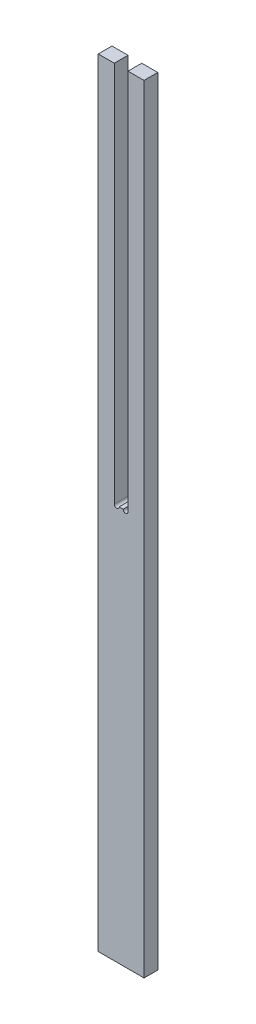
ISO-10303-21;
HEADER;
FILE_DESCRIPTION(('STEP AP214'),'2;1');
FILE_NAME('part.step','',(''),(''),'','','');
FILE_SCHEMA(('AUTOMOTIVE_DESIGN { 1 0 10303 214 1 1 1 1 }'));
ENDSEC;
DATA;
#1=APPLICATION_CONTEXT('core data for automotive mechanical design processes');
#2=APPLICATION_PROTOCOL_DEFINITION('international standard','automotive_design',2000,#1);
#3=PRODUCT_CONTEXT('',#1,'mechanical');
#4=PRODUCT('Part','Part','',(#3));
#5=PRODUCT_RELATED_PRODUCT_CATEGORY('part','',(#4));
#6=PRODUCT_DEFINITION_FORMATION('','',#4);
#7=PRODUCT_DEFINITION_CONTEXT('part definition',#1,'design');
#8=PRODUCT_DEFINITION('design','',#6,#7);
#9=PRODUCT_DEFINITION_SHAPE('','',#8);
#10=(LENGTH_UNIT() NAMED_UNIT(*) SI_UNIT(.MILLI.,.METRE.));
#11=(NAMED_UNIT(*) PLANE_ANGLE_UNIT() SI_UNIT($,.RADIAN.));
#12=(NAMED_UNIT(*) SI_UNIT($,.STERADIAN.) SOLID_ANGLE_UNIT());
#13=UNCERTAINTY_MEASURE_WITH_UNIT(LENGTH_MEASURE(1.E-05),#10,'distance_accuracy_value','');
#14=(GEOMETRIC_REPRESENTATION_CONTEXT(3) GLOBAL_UNCERTAINTY_ASSIGNED_CONTEXT((#13)) GLOBAL_UNIT_ASSIGNED_CONTEXT((#10,
#11,#12)) REPRESENTATION_CONTEXT('',''));
#15=CARTESIAN_POINT('',(0.,0.,0.));
#16=DIRECTION('',(0.,0.,1.));
#17=DIRECTION('',(1.,0.,0.));
#18=AXIS2_PLACEMENT_3D('',#15,#16,#17);
#19=CARTESIAN_POINT('',(-33.2222222222223,843.,18.));
#20=DIRECTION('',(0.,1.,0.));
#21=DIRECTION('',(0.,0.,1.));
#22=AXIS2_PLACEMENT_3D('',#19,#20,#21);
#23=PLANE('',#22);
#24=DIRECTION('',(1.,0.,0.));
#25=VECTOR('',#24,1.);
#26=CARTESIAN_POINT('',(-33.2222222222223,843.,0.));
#27=LINE('',#26,#25);
#28=CARTESIAN_POINT('',(-33.2222222222223,843.,0.));
#29=VERTEX_POINT('',#28);
#30=CARTESIAN_POINT('',(-12.2222222222223,843.,0.));
#31=VERTEX_POINT('',#30);
#32=EDGE_CURVE('E142',#29,#31,#27,.T.);
#33=ORIENTED_EDGE('',*,*,#32,.F.);
#34=DIRECTION('',(0.,0.,-1.));
#35=VECTOR('',#34,1.);
#36=CARTESIAN_POINT('',(-33.2222222222223,843.,18.));
#37=LINE('',#36,#35);
#38=CARTESIAN_POINT('',(-33.2222222222223,843.,18.));
#39=VERTEX_POINT('',#38);
#40=EDGE_CURVE('E11',#39,#29,#37,.T.);
#41=ORIENTED_EDGE('',*,*,#40,.F.);
#42=DIRECTION('',(1.,0.,0.));
#43=VECTOR('',#42,1.);
#44=CARTESIAN_POINT('',(-33.2222222222223,843.,18.));
#45=LINE('',#44,#43);
#46=CARTESIAN_POINT('',(-12.2222222222223,843.,18.));
#47=VERTEX_POINT('',#46);
#48=EDGE_CURVE('E167',#39,#47,#45,.T.);
#49=ORIENTED_EDGE('',*,*,#48,.T.);
#50=DIRECTION('',(0.,0.,-1.));
#51=VECTOR('',#50,1.);
#52=CARTESIAN_POINT('',(-12.2222222222223,843.,18.));
#53=LINE('',#52,#51);
#54=EDGE_CURVE('E36',#47,#31,#53,.T.);
#55=ORIENTED_EDGE('',*,*,#54,.T.);
#56=EDGE_LOOP('',(#33,#41,#49,#55));
#57=FACE_BOUND('',#56,.T.);
#58=ADVANCED_FACE('F33',(#57),#23,.T.);
#59=CARTESIAN_POINT('',(-33.2222222222223,343.,18.));
#60=DIRECTION('',(-1.,0.,0.));
#61=DIRECTION('',(0.,0.,1.));
#62=AXIS2_PLACEMENT_3D('',#59,#60,#61);
#63=PLANE('',#62);
#64=DIRECTION('',(0.,1.,0.));
#65=VECTOR('',#64,1.);
#66=CARTESIAN_POINT('',(-33.2222222222223,343.,0.));
#67=LINE('',#66,#65);
#68=CARTESIAN_POINT('',(-33.2222222222223,343.,0.));
#69=VERTEX_POINT('',#68);
#70=EDGE_CURVE('E165',#69,#29,#67,.T.);
#71=ORIENTED_EDGE('',*,*,#70,.F.);
#72=DIRECTION('',(0.,0.,-1.));
#73=VECTOR('',#72,1.);
#74=CARTESIAN_POINT('',(-33.2222222222223,343.,18.));
#75=LINE('',#74,#73);
#76=CARTESIAN_POINT('',(-33.2222222222223,343.,18.));
#77=VERTEX_POINT('',#76);
#78=EDGE_CURVE('E42',#77,#69,#75,.T.);
#79=ORIENTED_EDGE('',*,*,#78,.F.);
#80=DIRECTION('',(0.,1.,0.));
#81=VECTOR('',#80,1.);
#82=CARTESIAN_POINT('',(-33.2222222222223,343.,18.));
#83=LINE('',#82,#81);
#84=EDGE_CURVE('E124',#77,#39,#83,.T.);
#85=ORIENTED_EDGE('',*,*,#84,.T.);
#86=ORIENTED_EDGE('',*,*,#40,.T.);
#87=EDGE_LOOP('',(#71,#79,#85,#86));
#88=FACE_BOUND('',#87,.T.);
#89=ADVANCED_FACE('F185',(#88),#63,.T.);
#90=CARTESIAN_POINT('',(-36.3972222222223,343.,18.));
#91=DIRECTION('',(0.,0.,-1.));
#92=DIRECTION('',(-1.,0.,0.));
#93=AXIS2_PLACEMENT_3D('',#90,#91,#92);
#94=CYLINDRICAL_SURFACE('',#93,3.175);
#95=CARTESIAN_POINT('',(-36.3972222222223,343.,0.));
#96=DIRECTION('',(0.,0.,-1.));
#97=DIRECTION('',(-1.,0.,0.));
#98=AXIS2_PLACEMENT_3D('',#95,#96,#97);
#99=CIRCLE('',#98,3.175);
#100=CARTESIAN_POINT('',(-39.5722222222223,343.,0.));
#101=VERTEX_POINT('',#100);
#102=EDGE_CURVE('E128',#69,#101,#99,.T.);
#103=ORIENTED_EDGE('',*,*,#102,.T.);
#104=DIRECTION('',(0.,0.,-1.));
#105=VECTOR('',#104,1.);
#106=CARTESIAN_POINT('',(-39.5722222222223,343.,18.));
#107=LINE('',#106,#105);
#108=CARTESIAN_POINT('',(-39.5722222222223,343.,18.));
#109=VERTEX_POINT('',#108);
#110=EDGE_CURVE('E126',#109,#101,#107,.T.);
#111=ORIENTED_EDGE('',*,*,#110,.F.);
#112=CARTESIAN_POINT('',(-36.3972222222223,343.,18.));
#113=DIRECTION('',(0.,0.,-1.));
#114=DIRECTION('',(-1.,0.,0.));
#115=AXIS2_PLACEMENT_3D('',#112,#113,#114);
#116=CIRCLE('',#115,3.175);
#117=EDGE_CURVE('E117',#77,#109,#116,.T.);
#118=ORIENTED_EDGE('',*,*,#117,.F.);
#119=ORIENTED_EDGE('',*,*,#78,.T.);
#120=EDGE_LOOP('',(#103,#111,#118,#119));
#121=FACE_BOUND('',#120,.T.);
#122=ADVANCED_FACE('F127',(#121),#94,.F.);
#123=CARTESIAN_POINT('',(-44.8722222222223,343.,18.));
#124=DIRECTION('',(0.,1.,0.));
#125=DIRECTION('',(0.,0.,1.));
#126=AXIS2_PLACEMENT_3D('',#123,#124,#125);
#127=PLANE('',#126);
#128=DIRECTION('',(1.,0.,0.));
#129=VECTOR('',#128,1.);
#130=CARTESIAN_POINT('',(-44.8722222222223,343.,0.));
#131=LINE('',#130,#129);
#132=CARTESIAN_POINT('',(-44.8722222222223,343.,0.));
#133=VERTEX_POINT('',#132);
#134=EDGE_CURVE('E162',#133,#101,#131,.T.);
#135=ORIENTED_EDGE('',*,*,#134,.F.);
#136=DIRECTION('',(0.,0.,-1.));
#137=VECTOR('',#136,1.);
#138=CARTESIAN_POINT('',(-44.8722222222223,343.,18.));
#139=LINE('',#138,#137);
#140=CARTESIAN_POINT('',(-44.8722222222223,343.,18.));
#141=VERTEX_POINT('',#140);
#142=EDGE_CURVE('E132',#141,#133,#139,.T.);
#143=ORIENTED_EDGE('',*,*,#142,.F.);
#144=DIRECTION('',(1.,0.,0.));
#145=VECTOR('',#144,1.);
#146=CARTESIAN_POINT('',(-44.8722222222223,343.,18.));
#147=LINE('',#146,#145);
#148=EDGE_CURVE('E122',#141,#109,#147,.T.);
#149=ORIENTED_EDGE('',*,*,#148,.T.);
#150=ORIENTED_EDGE('',*,*,#110,.T.);
#151=EDGE_LOOP('',(#135,#143,#149,#150));
#152=FACE_BOUND('',#151,.T.);
#153=ADVANCED_FACE('F134',(#152),#127,.T.);
#154=CARTESIAN_POINT('',(-48.0472222222223,343.,18.));
#155=DIRECTION('',(0.,0.,-1.));
#156=DIRECTION('',(-1.,0.,0.));
#157=AXIS2_PLACEMENT_3D('',#154,#155,#156);
#158=CYLINDRICAL_SURFACE('',#157,3.175);
#159=CARTESIAN_POINT('',(-48.0472222222223,343.,0.));
#160=DIRECTION('',(0.,0.,1.));
#161=DIRECTION('',(1.,0.,0.));
#162=AXIS2_PLACEMENT_3D('',#159,#160,#161);
#163=CIRCLE('',#162,3.175);
#164=CARTESIAN_POINT('',(-51.2222222222223,343.,0.));
#165=VERTEX_POINT('',#164);
#166=EDGE_CURVE('E159',#165,#133,#163,.T.);
#167=ORIENTED_EDGE('',*,*,#166,.F.);
#168=DIRECTION('',(0.,0.,-1.));
#169=VECTOR('',#168,1.);
#170=CARTESIAN_POINT('',(-51.2222222222223,343.,18.));
#171=LINE('',#170,#169);
#172=CARTESIAN_POINT('',(-51.2222222222223,343.,18.));
#173=VERTEX_POINT('',#172);
#174=EDGE_CURVE('E171',#173,#165,#171,.T.);
#175=ORIENTED_EDGE('',*,*,#174,.F.);
#176=CARTESIAN_POINT('',(-48.0472222222223,343.,18.));
#177=DIRECTION('',(0.,0.,1.));
#178=DIRECTION('',(1.,0.,0.));
#179=AXIS2_PLACEMENT_3D('',#176,#177,#178);
#180=CIRCLE('',#179,3.175);
#181=EDGE_CURVE('E135',#173,#141,#180,.T.);
#182=ORIENTED_EDGE('',*,*,#181,.T.);
#183=ORIENTED_EDGE('',*,*,#142,.T.);
#184=EDGE_LOOP('',(#167,#175,#182,#183));
#185=FACE_BOUND('',#184,.T.);
#186=ADVANCED_FACE('F198',(#185),#158,.F.);
#187=CARTESIAN_POINT('',(-51.2222222222223,843.,18.));
#188=DIRECTION('',(1.,0.,0.));
#189=DIRECTION('',(0.,1.,0.));
#190=AXIS2_PLACEMENT_3D('',#187,#188,#189);
#191=PLANE('',#190);
#192=DIRECTION('',(0.,-1.,0.));
#193=VECTOR('',#192,1.);
#194=CARTESIAN_POINT('',(-51.2222222222223,843.,0.));
#195=LINE('',#194,#193);
#196=CARTESIAN_POINT('',(-51.2222222222223,843.,0.));
#197=VERTEX_POINT('',#196);
#198=EDGE_CURVE('E156',#197,#165,#195,.T.);
#199=ORIENTED_EDGE('',*,*,#198,.F.);
#200=DIRECTION('',(0.,0.,-1.));
#201=VECTOR('',#200,1.);
#202=CARTESIAN_POINT('',(-51.2222222222223,843.,18.));
#203=LINE('',#202,#201);
#204=CARTESIAN_POINT('',(-51.2222222222223,843.,18.));
#205=VERTEX_POINT('',#204);
#206=EDGE_CURVE('E173',#205,#197,#203,.T.);
#207=ORIENTED_EDGE('',*,*,#206,.F.);
#208=DIRECTION('',(0.,-1.,0.));
#209=VECTOR('',#208,1.);
#210=CARTESIAN_POINT('',(-51.2222222222223,843.,18.));
#211=LINE('',#210,#209);
#212=EDGE_CURVE('E137',#205,#173,#211,.T.);
#213=ORIENTED_EDGE('',*,*,#212,.T.);
#214=ORIENTED_EDGE('',*,*,#174,.T.);
#215=EDGE_LOOP('',(#199,#207,#213,#214));
#216=FACE_BOUND('',#215,.T.);
#217=ADVANCED_FACE('F201',(#216),#191,.T.);
#218=CARTESIAN_POINT('',(-72.2222222222223,843.,18.));
#219=DIRECTION('',(0.,1.,0.));
#220=DIRECTION('',(0.,0.,1.));
#221=AXIS2_PLACEMENT_3D('',#218,#219,#220);
#222=PLANE('',#221);
#223=DIRECTION('',(1.,0.,0.));
#224=VECTOR('',#223,1.);
#225=CARTESIAN_POINT('',(-72.2222222222223,843.,0.));
#226=LINE('',#225,#224);
#227=CARTESIAN_POINT('',(-72.2222222222223,843.,0.));
#228=VERTEX_POINT('',#227);
#229=EDGE_CURVE('E153',#228,#197,#226,.T.);
#230=ORIENTED_EDGE('',*,*,#229,.F.);
#231=DIRECTION('',(0.,0.,-1.));
#232=VECTOR('',#231,1.);
#233=CARTESIAN_POINT('',(-72.2222222222223,843.,18.));
#234=LINE('',#233,#232);
#235=CARTESIAN_POINT('',(-72.2222222222223,843.,18.));
#236=VERTEX_POINT('',#235);
#237=EDGE_CURVE('E175',#236,#228,#234,.T.);
#238=ORIENTED_EDGE('',*,*,#237,.F.);
#239=DIRECTION('',(1.,0.,0.));
#240=VECTOR('',#239,1.);
#241=CARTESIAN_POINT('',(-72.2222222222223,843.,18.));
#242=LINE('',#241,#240);
#243=EDGE_CURVE('E298',#236,#205,#242,.T.);
#244=ORIENTED_EDGE('',*,*,#243,.T.);
#245=ORIENTED_EDGE('',*,*,#206,.T.);
#246=EDGE_LOOP('',(#230,#238,#244,#245));
#247=FACE_BOUND('',#246,.T.);
#248=ADVANCED_FACE('F205',(#247),#222,.T.);
#249=CARTESIAN_POINT('',(-72.2222222222223,843.,18.));
#250=DIRECTION('',(1.,0.,0.));
#251=DIRECTION('',(0.,1.,0.));
#252=AXIS2_PLACEMENT_3D('',#249,#250,#251);
#253=PLANE('',#252);
#254=DIRECTION('',(0.,-1.,0.));
#255=VECTOR('',#254,1.);
#256=CARTESIAN_POINT('',(-72.2222222222223,843.,0.));
#257=LINE('',#256,#255);
#258=CARTESIAN_POINT('',(-72.2222222222222,-175.,0.));
#259=VERTEX_POINT('',#258);
#260=EDGE_CURVE('E151',#228,#259,#257,.T.);
#261=ORIENTED_EDGE('',*,*,#260,.T.);
#262=DIRECTION('',(0.,0.,-1.));
#263=VECTOR('',#262,1.);
#264=CARTESIAN_POINT('',(-72.2222222222222,-175.,18.));
#265=LINE('',#264,#263);
#266=CARTESIAN_POINT('',(-72.2222222222222,-175.,18.));
#267=VERTEX_POINT('',#266);
#268=EDGE_CURVE('E177',#267,#259,#265,.T.);
#269=ORIENTED_EDGE('',*,*,#268,.F.);
#270=DIRECTION('',(0.,-1.,0.));
#271=VECTOR('',#270,1.);
#272=CARTESIAN_POINT('',(-72.2222222222223,843.,18.));
#273=LINE('',#272,#271);
#274=EDGE_CURVE('E302',#236,#267,#273,.T.);
#275=ORIENTED_EDGE('',*,*,#274,.F.);
#276=ORIENTED_EDGE('',*,*,#237,.T.);
#277=EDGE_LOOP('',(#261,#269,#275,#276));
#278=FACE_BOUND('',#277,.T.);
#279=ADVANCED_FACE('F209',(#278),#253,.F.);
#280=CARTESIAN_POINT('',(-72.2222222222222,-175.,18.));
#281=DIRECTION('',(0.,1.,0.));
#282=DIRECTION('',(0.,0.,1.));
#283=AXIS2_PLACEMENT_3D('',#280,#281,#282);
#284=PLANE('',#283);
#285=DIRECTION('',(1.,0.,0.));
#286=VECTOR('',#285,1.);
#287=CARTESIAN_POINT('',(-72.2222222222222,-175.,0.));
#288=LINE('',#287,#286);
#289=CARTESIAN_POINT('',(-12.2222222222222,-175.,0.));
#290=VERTEX_POINT('',#289);
#291=EDGE_CURVE('E148',#259,#290,#288,.T.);
#292=ORIENTED_EDGE('',*,*,#291,.T.);
#293=DIRECTION('',(0.,0.,-1.));
#294=VECTOR('',#293,1.);
#295=CARTESIAN_POINT('',(-12.2222222222222,-175.,18.));
#296=LINE('',#295,#294);
#297=CARTESIAN_POINT('',(-12.2222222222222,-175.,18.));
#298=VERTEX_POINT('',#297);
#299=EDGE_CURVE('E179',#298,#290,#296,.T.);
#300=ORIENTED_EDGE('',*,*,#299,.F.);
#301=DIRECTION('',(1.,0.,0.));
#302=VECTOR('',#301,1.);
#303=CARTESIAN_POINT('',(-72.2222222222222,-175.,18.));
#304=LINE('',#303,#302);
#305=EDGE_CURVE('E306',#267,#298,#304,.T.);
#306=ORIENTED_EDGE('',*,*,#305,.F.);
#307=ORIENTED_EDGE('',*,*,#268,.T.);
#308=EDGE_LOOP('',(#292,#300,#306,#307));
#309=FACE_BOUND('',#308,.T.);
#310=ADVANCED_FACE('F213',(#309),#284,.F.);
#311=CARTESIAN_POINT('',(-12.2222222222223,843.,18.));
#312=DIRECTION('',(1.,0.,0.));
#313=DIRECTION('',(0.,1.,0.));
#314=AXIS2_PLACEMENT_3D('',#311,#312,#313);
#315=PLANE('',#314);
#316=DIRECTION('',(0.,-1.,0.));
#317=VECTOR('',#316,1.);
#318=CARTESIAN_POINT('',(-12.2222222222223,843.,0.));
#319=LINE('',#318,#317);
#320=EDGE_CURVE('E145',#31,#290,#319,.T.);
#321=ORIENTED_EDGE('',*,*,#320,.F.);
#322=ORIENTED_EDGE('',*,*,#54,.F.);
#323=DIRECTION('',(0.,-1.,0.));
#324=VECTOR('',#323,1.);
#325=CARTESIAN_POINT('',(-12.2222222222223,843.,18.));
#326=LINE('',#325,#324);
#327=EDGE_CURVE('E308',#47,#298,#326,.T.);
#328=ORIENTED_EDGE('',*,*,#327,.T.);
#329=ORIENTED_EDGE('',*,*,#299,.T.);
#330=EDGE_LOOP('',(#321,#322,#328,#329));
#331=FACE_BOUND('',#330,.T.);
#332=ADVANCED_FACE('F181',(#331),#315,.T.);
#333=CARTESIAN_POINT('',(-48.0472222222223,343.,18.));
#334=DIRECTION('',(0.,0.,1.));
#335=DIRECTION('',(1.,0.,0.));
#336=AXIS2_PLACEMENT_3D('',#333,#334,#335);
#337=PLANE('',#336);
#338=ORIENTED_EDGE('',*,*,#48,.F.);
#339=ORIENTED_EDGE('',*,*,#84,.F.);
#340=ORIENTED_EDGE('',*,*,#117,.T.);
#341=ORIENTED_EDGE('',*,*,#148,.F.);
#342=ORIENTED_EDGE('',*,*,#181,.F.);
#343=ORIENTED_EDGE('',*,*,#212,.F.);
#344=ORIENTED_EDGE('',*,*,#243,.F.);
#345=ORIENTED_EDGE('',*,*,#274,.T.);
#346=ORIENTED_EDGE('',*,*,#305,.T.);
#347=ORIENTED_EDGE('',*,*,#327,.F.);
#348=EDGE_LOOP('',(#338,#339,#340,#341,#342,#343,#344,#345,#346,#347));
#349=FACE_BOUND('',#348,.T.);
#350=ADVANCED_FACE('F119',(#349),#337,.T.);
#351=CARTESIAN_POINT('',(-48.0472222222223,343.,0.));
#352=DIRECTION('',(0.,0.,1.));
#353=DIRECTION('',(1.,0.,0.));
#354=AXIS2_PLACEMENT_3D('',#351,#352,#353);
#355=PLANE('',#354);
#356=ORIENTED_EDGE('',*,*,#32,.T.);
#357=ORIENTED_EDGE('',*,*,#320,.T.);
#358=ORIENTED_EDGE('',*,*,#291,.F.);
#359=ORIENTED_EDGE('',*,*,#260,.F.);
#360=ORIENTED_EDGE('',*,*,#229,.T.);
#361=ORIENTED_EDGE('',*,*,#198,.T.);
#362=ORIENTED_EDGE('',*,*,#166,.T.);
#363=ORIENTED_EDGE('',*,*,#134,.T.);
#364=ORIENTED_EDGE('',*,*,#102,.F.);
#365=ORIENTED_EDGE('',*,*,#70,.T.);
#366=EDGE_LOOP('',(#356,#357,#358,#359,#360,#361,#362,#363,#364,#365));
#367=FACE_BOUND('',#366,.T.);
#368=ADVANCED_FACE('F184',(#367),#355,.F.);
#369=CLOSED_SHELL('',(#58,#89,#122,#153,#186,#217,#248,#279,#310,#332,#350,#368));
#370=MANIFOLD_SOLID_BREP('B2',#369);
#371=ADVANCED_BREP_SHAPE_REPRESENTATION('',(#18,#370),#14);
#372=SHAPE_DEFINITION_REPRESENTATION(#9,#371);
ENDSEC;
END-ISO-10303-21;
